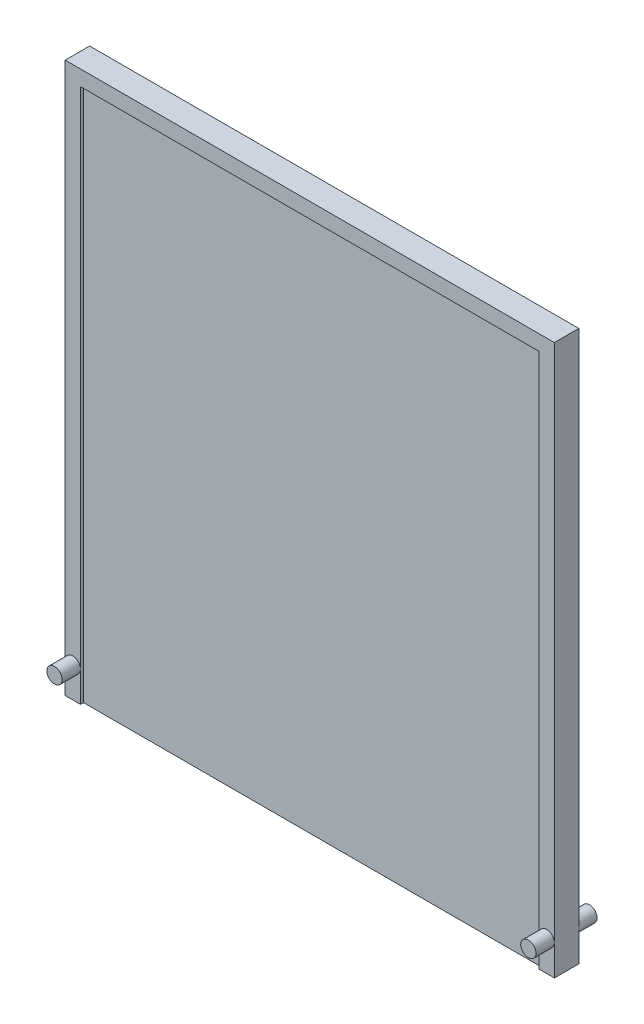
ISO-10303-21;
HEADER;
FILE_DESCRIPTION(('STEP AP214'),'2;1');
FILE_NAME('part.step','',(''),(''),'','','');
FILE_SCHEMA(('AUTOMOTIVE_DESIGN { 1 0 10303 214 1 1 1 1 }'));
ENDSEC;
DATA;
#1=APPLICATION_CONTEXT('core data for automotive mechanical design processes');
#2=APPLICATION_PROTOCOL_DEFINITION('international standard','automotive_design',2000,#1);
#3=PRODUCT_CONTEXT('',#1,'mechanical');
#4=PRODUCT('Part','Part','',(#3));
#5=PRODUCT_RELATED_PRODUCT_CATEGORY('part','',(#4));
#6=PRODUCT_DEFINITION_FORMATION('','',#4);
#7=PRODUCT_DEFINITION_CONTEXT('part definition',#1,'design');
#8=PRODUCT_DEFINITION('design','',#6,#7);
#9=PRODUCT_DEFINITION_SHAPE('','',#8);
#10=(LENGTH_UNIT() NAMED_UNIT(*) SI_UNIT(.MILLI.,.METRE.));
#11=(NAMED_UNIT(*) PLANE_ANGLE_UNIT() SI_UNIT($,.RADIAN.));
#12=(NAMED_UNIT(*) SI_UNIT($,.STERADIAN.) SOLID_ANGLE_UNIT());
#13=UNCERTAINTY_MEASURE_WITH_UNIT(LENGTH_MEASURE(1.E-05),#10,'distance_accuracy_value','');
#14=(GEOMETRIC_REPRESENTATION_CONTEXT(3) GLOBAL_UNCERTAINTY_ASSIGNED_CONTEXT((#13)) GLOBAL_UNIT_ASSIGNED_CONTEXT((#10,
#11,#12)) REPRESENTATION_CONTEXT('',''));
#15=CARTESIAN_POINT('',(0.,0.,0.));
#16=DIRECTION('',(0.,0.,1.));
#17=DIRECTION('',(1.,0.,0.));
#18=AXIS2_PLACEMENT_3D('',#15,#16,#17);
#19=CARTESIAN_POINT('',(0.,0.,4.));
#20=DIRECTION('',(0.,0.,-1.));
#21=DIRECTION('',(-1.,0.,0.));
#22=AXIS2_PLACEMENT_3D('',#19,#20,#21);
#23=PLANE('',#22);
#24=CARTESIAN_POINT('',(77.5,-80.,4.));
#25=DIRECTION('',(0.,0.,-1.));
#26=DIRECTION('',(-1.,0.,0.));
#27=AXIS2_PLACEMENT_3D('',#24,#25,#26);
#28=CIRCLE('',#27,2.50000000000001);
#29=CARTESIAN_POINT('',(75.,-80.,4.));
#30=VERTEX_POINT('',#29);
#31=CARTESIAN_POINT('',(80.,-80.,4.));
#32=VERTEX_POINT('',#31);
#33=EDGE_CURVE('E143',#30,#32,#28,.F.);
#34=ORIENTED_EDGE('',*,*,#33,.F.);
#35=DIRECTION('',(0.,1.,0.));
#36=VECTOR('',#35,1.);
#37=CARTESIAN_POINT('',(75.,-90.,4.));
#38=LINE('',#37,#36);
#39=CARTESIAN_POINT('',(75.,-90.,4.));
#40=VERTEX_POINT('',#39);
#41=EDGE_CURVE('E122',#40,#30,#38,.T.);
#42=ORIENTED_EDGE('',*,*,#41,.F.);
#43=DIRECTION('',(1.,0.,0.));
#44=VECTOR('',#43,1.);
#45=CARTESIAN_POINT('',(-80.,-90.,4.));
#46=LINE('',#45,#44);
#47=CARTESIAN_POINT('',(80.,-90.,4.));
#48=VERTEX_POINT('',#47);
#49=EDGE_CURVE('E220',#40,#48,#46,.T.);
#50=ORIENTED_EDGE('',*,*,#49,.T.);
#51=DIRECTION('',(0.,1.,0.));
#52=VECTOR('',#51,1.);
#53=CARTESIAN_POINT('',(80.,-90.,4.));
#54=LINE('',#53,#52);
#55=EDGE_CURVE('E145',#48,#32,#54,.T.);
#56=ORIENTED_EDGE('',*,*,#55,.T.);
#57=EDGE_LOOP('',(#34,#42,#50,#56));
#58=FACE_BOUND('',#57,.T.);
#59=ADVANCED_FACE('F39',(#58),#23,.F.);
#60=CARTESIAN_POINT('',(-77.5,-80.,4.));
#61=DIRECTION('',(0.,0.,-1.));
#62=DIRECTION('',(-1.,0.,0.));
#63=AXIS2_PLACEMENT_3D('',#60,#61,#62);
#64=CIRCLE('',#63,2.50000000000001);
#65=CARTESIAN_POINT('',(-80.,-80.,4.));
#66=VERTEX_POINT('',#65);
#67=CARTESIAN_POINT('',(-75.,-80.,4.));
#68=VERTEX_POINT('',#67);
#69=EDGE_CURVE('E172',#66,#68,#64,.F.);
#70=ORIENTED_EDGE('',*,*,#69,.F.);
#71=DIRECTION('',(0.,-1.,0.));
#72=VECTOR('',#71,1.);
#73=CARTESIAN_POINT('',(-80.,-90.,4.));
#74=LINE('',#73,#72);
#75=CARTESIAN_POINT('',(-80.,-90.,4.));
#76=VERTEX_POINT('',#75);
#77=EDGE_CURVE('E216',#66,#76,#74,.T.);
#78=ORIENTED_EDGE('',*,*,#77,.T.);
#79=CARTESIAN_POINT('',(-75.,-90.,4.));
#80=VERTEX_POINT('',#79);
#81=EDGE_CURVE('E221',#76,#80,#46,.T.);
#82=ORIENTED_EDGE('',*,*,#81,.T.);
#83=DIRECTION('',(0.,-1.,0.));
#84=VECTOR('',#83,1.);
#85=CARTESIAN_POINT('',(-75.,-90.,4.));
#86=LINE('',#85,#84);
#87=EDGE_CURVE('E194',#68,#80,#86,.T.);
#88=ORIENTED_EDGE('',*,*,#87,.F.);
#89=EDGE_LOOP('',(#70,#78,#82,#88));
#90=FACE_BOUND('',#89,.T.);
#91=ADVANCED_FACE('F283',(#90),#23,.F.);
#92=CARTESIAN_POINT('',(80.,-90.,4.));
#93=DIRECTION('',(-1.,0.,0.));
#94=DIRECTION('',(0.,0.,1.));
#95=AXIS2_PLACEMENT_3D('',#92,#93,#94);
#96=PLANE('',#95);
#97=DIRECTION('',(0.,1.,0.));
#98=VECTOR('',#97,1.);
#99=CARTESIAN_POINT('',(80.,-90.,-4.));
#100=LINE('',#99,#98);
#101=CARTESIAN_POINT('',(80.,-90.,-4.));
#102=VERTEX_POINT('',#101);
#103=CARTESIAN_POINT('',(80.,-80.,-4.));
#104=VERTEX_POINT('',#103);
#105=EDGE_CURVE('E226',#102,#104,#100,.T.);
#106=ORIENTED_EDGE('',*,*,#105,.T.);
#107=CARTESIAN_POINT('',(80.,90.,-4.));
#108=VERTEX_POINT('',#107);
#109=EDGE_CURVE('E200',#104,#108,#100,.T.);
#110=ORIENTED_EDGE('',*,*,#109,.T.);
#111=DIRECTION('',(0.,0.,-1.));
#112=VECTOR('',#111,1.);
#113=CARTESIAN_POINT('',(80.,90.,4.));
#114=LINE('',#113,#112);
#115=CARTESIAN_POINT('',(80.,90.,4.));
#116=VERTEX_POINT('',#115);
#117=EDGE_CURVE('E11',#116,#108,#114,.T.);
#118=ORIENTED_EDGE('',*,*,#117,.F.);
#119=EDGE_CURVE('E213',#32,#116,#54,.T.);
#120=ORIENTED_EDGE('',*,*,#119,.F.);
#121=ORIENTED_EDGE('',*,*,#55,.F.);
#122=DIRECTION('',(0.,0.,-1.));
#123=VECTOR('',#122,1.);
#124=CARTESIAN_POINT('',(80.,-90.,4.));
#125=LINE('',#124,#123);
#126=EDGE_CURVE('E225',#48,#102,#125,.T.);
#127=ORIENTED_EDGE('',*,*,#126,.T.);
#128=EDGE_LOOP('',(#106,#110,#118,#120,#121,#127));
#129=FACE_BOUND('',#128,.T.);
#130=ADVANCED_FACE('F41',(#129),#96,.F.);
#131=CARTESIAN_POINT('',(-80.,90.,4.));
#132=DIRECTION('',(0.,-1.,0.));
#133=DIRECTION('',(0.,0.,-1.));
#134=AXIS2_PLACEMENT_3D('',#131,#132,#133);
#135=PLANE('',#134);
#136=DIRECTION('',(-1.,0.,0.));
#137=VECTOR('',#136,1.);
#138=CARTESIAN_POINT('',(-80.,90.,-4.));
#139=LINE('',#138,#137);
#140=CARTESIAN_POINT('',(-80.,90.,-4.));
#141=VERTEX_POINT('',#140);
#142=EDGE_CURVE('E230',#108,#141,#139,.T.);
#143=ORIENTED_EDGE('',*,*,#142,.T.);
#144=DIRECTION('',(0.,0.,-1.));
#145=VECTOR('',#144,1.);
#146=CARTESIAN_POINT('',(-80.,90.,4.));
#147=LINE('',#146,#145);
#148=CARTESIAN_POINT('',(-80.,90.,4.));
#149=VERTEX_POINT('',#148);
#150=EDGE_CURVE('E48',#149,#141,#147,.T.);
#151=ORIENTED_EDGE('',*,*,#150,.F.);
#152=DIRECTION('',(-1.,0.,0.));
#153=VECTOR('',#152,1.);
#154=CARTESIAN_POINT('',(-80.,90.,4.));
#155=LINE('',#154,#153);
#156=EDGE_CURVE('E212',#116,#149,#155,.T.);
#157=ORIENTED_EDGE('',*,*,#156,.F.);
#158=ORIENTED_EDGE('',*,*,#117,.T.);
#159=EDGE_LOOP('',(#143,#151,#157,#158));
#160=FACE_BOUND('',#159,.T.);
#161=ADVANCED_FACE('F302',(#160),#135,.F.);
#162=CARTESIAN_POINT('',(-80.,-90.,4.));
#163=DIRECTION('',(1.,0.,0.));
#164=DIRECTION('',(0.,0.,-1.));
#165=AXIS2_PLACEMENT_3D('',#162,#163,#164);
#166=PLANE('',#165);
#167=DIRECTION('',(0.,-1.,0.));
#168=VECTOR('',#167,1.);
#169=CARTESIAN_POINT('',(-80.,-90.,-4.));
#170=LINE('',#169,#168);
#171=CARTESIAN_POINT('',(-80.,-80.,-4.));
#172=VERTEX_POINT('',#171);
#173=EDGE_CURVE('E234',#141,#172,#170,.T.);
#174=ORIENTED_EDGE('',*,*,#173,.T.);
#175=CARTESIAN_POINT('',(-80.,-90.,-4.));
#176=VERTEX_POINT('',#175);
#177=EDGE_CURVE('E233',#172,#176,#170,.T.);
#178=ORIENTED_EDGE('',*,*,#177,.T.);
#179=DIRECTION('',(0.,0.,-1.));
#180=VECTOR('',#179,1.);
#181=CARTESIAN_POINT('',(-80.,-90.,4.));
#182=LINE('',#181,#180);
#183=EDGE_CURVE('E244',#76,#176,#182,.T.);
#184=ORIENTED_EDGE('',*,*,#183,.F.);
#185=ORIENTED_EDGE('',*,*,#77,.F.);
#186=EDGE_CURVE('E217',#149,#66,#74,.T.);
#187=ORIENTED_EDGE('',*,*,#186,.F.);
#188=ORIENTED_EDGE('',*,*,#150,.T.);
#189=EDGE_LOOP('',(#174,#178,#184,#185,#187,#188));
#190=FACE_BOUND('',#189,.T.);
#191=ADVANCED_FACE('F253',(#190),#166,.F.);
#192=CARTESIAN_POINT('',(-80.,-90.,4.));
#193=DIRECTION('',(0.,1.,0.));
#194=DIRECTION('',(0.,0.,1.));
#195=AXIS2_PLACEMENT_3D('',#192,#193,#194);
#196=PLANE('',#195);
#197=ORIENTED_EDGE('',*,*,#49,.F.);
#198=DIRECTION('',(0.,0.,1.));
#199=VECTOR('',#198,1.);
#200=CARTESIAN_POINT('',(75.,-90.,3.));
#201=LINE('',#200,#199);
#202=CARTESIAN_POINT('',(75.,-90.,3.));
#203=VERTEX_POINT('',#202);
#204=EDGE_CURVE('E128',#203,#40,#201,.T.);
#205=ORIENTED_EDGE('',*,*,#204,.F.);
#206=DIRECTION('',(1.,0.,0.));
#207=VECTOR('',#206,1.);
#208=CARTESIAN_POINT('',(-75.,-90.,3.));
#209=LINE('',#208,#207);
#210=CARTESIAN_POINT('',(-75.,-90.,3.));
#211=VERTEX_POINT('',#210);
#212=EDGE_CURVE('E187',#211,#203,#209,.T.);
#213=ORIENTED_EDGE('',*,*,#212,.F.);
#214=DIRECTION('',(0.,0.,1.));
#215=VECTOR('',#214,1.);
#216=CARTESIAN_POINT('',(-75.,-90.,3.));
#217=LINE('',#216,#215);
#218=EDGE_CURVE('E201',#211,#80,#217,.T.);
#219=ORIENTED_EDGE('',*,*,#218,.T.);
#220=ORIENTED_EDGE('',*,*,#81,.F.);
#221=ORIENTED_EDGE('',*,*,#183,.T.);
#222=DIRECTION('',(1.,0.,0.));
#223=VECTOR('',#222,1.);
#224=CARTESIAN_POINT('',(-80.,-90.,-4.));
#225=LINE('',#224,#223);
#226=EDGE_CURVE('E238',#176,#102,#225,.T.);
#227=ORIENTED_EDGE('',*,*,#226,.T.);
#228=ORIENTED_EDGE('',*,*,#126,.F.);
#229=EDGE_LOOP('',(#197,#205,#213,#219,#220,#221,#227,#228));
#230=FACE_BOUND('',#229,.T.);
#231=ADVANCED_FACE('F292',(#230),#196,.F.);
#232=EDGE_CURVE('E55',#32,#30,#28,.F.);
#233=ORIENTED_EDGE('',*,*,#232,.F.);
#234=ORIENTED_EDGE('',*,*,#119,.T.);
#235=ORIENTED_EDGE('',*,*,#156,.T.);
#236=ORIENTED_EDGE('',*,*,#186,.T.);
#237=EDGE_CURVE('E165',#68,#66,#64,.F.);
#238=ORIENTED_EDGE('',*,*,#237,.F.);
#239=CARTESIAN_POINT('',(-75.,85.,4.));
#240=VERTEX_POINT('',#239);
#241=EDGE_CURVE('E180',#240,#68,#86,.T.);
#242=ORIENTED_EDGE('',*,*,#241,.F.);
#243=DIRECTION('',(-1.,0.,0.));
#244=VECTOR('',#243,1.);
#245=CARTESIAN_POINT('',(-75.,85.,4.));
#246=LINE('',#245,#244);
#247=CARTESIAN_POINT('',(75.,85.,4.));
#248=VERTEX_POINT('',#247);
#249=EDGE_CURVE('E133',#248,#240,#246,.T.);
#250=ORIENTED_EDGE('',*,*,#249,.F.);
#251=EDGE_CURVE('E125',#30,#248,#38,.T.);
#252=ORIENTED_EDGE('',*,*,#251,.F.);
#253=EDGE_LOOP('',(#233,#234,#235,#236,#238,#242,#250,#252));
#254=FACE_BOUND('',#253,.T.);
#255=ADVANCED_FACE('F136',(#254),#23,.F.);
#256=CARTESIAN_POINT('',(0.,0.,-4.));
#257=DIRECTION('',(0.,0.,-1.));
#258=DIRECTION('',(-1.,0.,0.));
#259=AXIS2_PLACEMENT_3D('',#256,#257,#258);
#260=PLANE('',#259);
#261=ORIENTED_EDGE('',*,*,#109,.F.);
#262=CARTESIAN_POINT('',(77.5,-80.,-4.));
#263=DIRECTION('',(0.,0.,-1.));
#264=DIRECTION('',(-1.,0.,0.));
#265=AXIS2_PLACEMENT_3D('',#262,#263,#264);
#266=CIRCLE('',#265,2.50000000000001);
#267=EDGE_CURVE('E61',#104,#104,#266,.F.);
#268=ORIENTED_EDGE('',*,*,#267,.T.);
#269=ORIENTED_EDGE('',*,*,#105,.F.);
#270=ORIENTED_EDGE('',*,*,#226,.F.);
#271=ORIENTED_EDGE('',*,*,#177,.F.);
#272=CARTESIAN_POINT('',(-77.5,-80.,-4.));
#273=DIRECTION('',(0.,0.,-1.));
#274=DIRECTION('',(-1.,0.,0.));
#275=AXIS2_PLACEMENT_3D('',#272,#273,#274);
#276=CIRCLE('',#275,2.50000000000001);
#277=EDGE_CURVE('E140',#172,#172,#276,.F.);
#278=ORIENTED_EDGE('',*,*,#277,.T.);
#279=ORIENTED_EDGE('',*,*,#173,.F.);
#280=ORIENTED_EDGE('',*,*,#142,.F.);
#281=EDGE_LOOP('',(#261,#268,#269,#270,#271,#278,#279,#280));
#282=FACE_BOUND('',#281,.T.);
#283=ADVANCED_FACE('F260',(#282),#260,.T.);
#284=CARTESIAN_POINT('',(75.,-90.,3.));
#285=DIRECTION('',(1.,0.,0.));
#286=DIRECTION('',(0.,0.,-1.));
#287=AXIS2_PLACEMENT_3D('',#284,#285,#286);
#288=PLANE('',#287);
#289=DIRECTION('',(0.,0.,1.));
#290=VECTOR('',#289,1.);
#291=CARTESIAN_POINT('',(75.,85.,3.));
#292=LINE('',#291,#290);
#293=CARTESIAN_POINT('',(75.,85.,3.));
#294=VERTEX_POINT('',#293);
#295=EDGE_CURVE('E190',#294,#248,#292,.T.);
#296=ORIENTED_EDGE('',*,*,#295,.F.);
#297=DIRECTION('',(0.,1.,0.));
#298=VECTOR('',#297,1.);
#299=CARTESIAN_POINT('',(75.,-90.,3.));
#300=LINE('',#299,#298);
#301=EDGE_CURVE('E176',#203,#294,#300,.T.);
#302=ORIENTED_EDGE('',*,*,#301,.F.);
#303=ORIENTED_EDGE('',*,*,#204,.T.);
#304=ORIENTED_EDGE('',*,*,#41,.T.);
#305=ORIENTED_EDGE('',*,*,#251,.T.);
#306=EDGE_LOOP('',(#296,#302,#303,#304,#305));
#307=FACE_BOUND('',#306,.T.);
#308=ADVANCED_FACE('F124',(#307),#288,.F.);
#309=CARTESIAN_POINT('',(-75.,-90.,3.));
#310=DIRECTION('',(-1.,0.,0.));
#311=DIRECTION('',(0.,0.,1.));
#312=AXIS2_PLACEMENT_3D('',#309,#310,#311);
#313=PLANE('',#312);
#314=ORIENTED_EDGE('',*,*,#218,.F.);
#315=DIRECTION('',(0.,-1.,0.));
#316=VECTOR('',#315,1.);
#317=CARTESIAN_POINT('',(-75.,-90.,3.));
#318=LINE('',#317,#316);
#319=CARTESIAN_POINT('',(-75.,85.,3.));
#320=VERTEX_POINT('',#319);
#321=EDGE_CURVE('E184',#320,#211,#318,.T.);
#322=ORIENTED_EDGE('',*,*,#321,.F.);
#323=DIRECTION('',(0.,0.,1.));
#324=VECTOR('',#323,1.);
#325=CARTESIAN_POINT('',(-75.,85.,3.));
#326=LINE('',#325,#324);
#327=EDGE_CURVE('E205',#320,#240,#326,.T.);
#328=ORIENTED_EDGE('',*,*,#327,.T.);
#329=ORIENTED_EDGE('',*,*,#241,.T.);
#330=ORIENTED_EDGE('',*,*,#87,.T.);
#331=EDGE_LOOP('',(#314,#322,#328,#329,#330));
#332=FACE_BOUND('',#331,.T.);
#333=ADVANCED_FACE('F322',(#332),#313,.F.);
#334=CARTESIAN_POINT('',(-75.,85.,3.));
#335=DIRECTION('',(0.,1.,0.));
#336=DIRECTION('',(0.,0.,1.));
#337=AXIS2_PLACEMENT_3D('',#334,#335,#336);
#338=PLANE('',#337);
#339=ORIENTED_EDGE('',*,*,#249,.T.);
#340=ORIENTED_EDGE('',*,*,#327,.F.);
#341=DIRECTION('',(-1.,0.,0.));
#342=VECTOR('',#341,1.);
#343=CARTESIAN_POINT('',(-75.,85.,3.));
#344=LINE('',#343,#342);
#345=EDGE_CURVE('E179',#294,#320,#344,.T.);
#346=ORIENTED_EDGE('',*,*,#345,.F.);
#347=ORIENTED_EDGE('',*,*,#295,.T.);
#348=EDGE_LOOP('',(#339,#340,#346,#347));
#349=FACE_BOUND('',#348,.T.);
#350=ADVANCED_FACE('F278',(#349),#338,.F.);
#351=CARTESIAN_POINT('',(0.,0.,3.));
#352=DIRECTION('',(0.,0.,-1.));
#353=DIRECTION('',(-1.,0.,0.));
#354=AXIS2_PLACEMENT_3D('',#351,#352,#353);
#355=PLANE('',#354);
#356=ORIENTED_EDGE('',*,*,#301,.T.);
#357=ORIENTED_EDGE('',*,*,#345,.T.);
#358=ORIENTED_EDGE('',*,*,#321,.T.);
#359=ORIENTED_EDGE('',*,*,#212,.T.);
#360=EDGE_LOOP('',(#356,#357,#358,#359));
#361=FACE_BOUND('',#360,.T.);
#362=ADVANCED_FACE('F273',(#361),#355,.F.);
#363=CARTESIAN_POINT('',(-77.5,-80.,-10.));
#364=DIRECTION('',(0.,0.,1.));
#365=DIRECTION('',(1.,0.,0.));
#366=AXIS2_PLACEMENT_3D('',#363,#364,#365);
#367=PLANE('',#366);
#368=CARTESIAN_POINT('',(-77.5,-80.,-10.));
#369=DIRECTION('',(0.,0.,1.));
#370=DIRECTION('',(1.,0.,0.));
#371=AXIS2_PLACEMENT_3D('',#368,#369,#370);
#372=CIRCLE('',#371,2.50000000000001);
#373=CARTESIAN_POINT('',(-75.,-80.,-10.));
#374=VERTEX_POINT('',#373);
#375=EDGE_CURVE('E160',#374,#374,#372,.T.);
#376=ORIENTED_EDGE('',*,*,#375,.F.);
#377=EDGE_LOOP('',(#376));
#378=FACE_BOUND('',#377,.T.);
#379=ADVANCED_FACE('F268',(#378),#367,.F.);
#380=CARTESIAN_POINT('',(-77.5,-80.,10.));
#381=DIRECTION('',(0.,0.,-1.));
#382=DIRECTION('',(-1.,0.,0.));
#383=AXIS2_PLACEMENT_3D('',#380,#381,#382);
#384=CYLINDRICAL_SURFACE('',#383,2.50000000000001);
#385=ORIENTED_EDGE('',*,*,#277,.F.);
#386=EDGE_LOOP('',(#385));
#387=FACE_BOUND('',#386,.T.);
#388=ORIENTED_EDGE('',*,*,#375,.T.);
#389=EDGE_LOOP('',(#388));
#390=FACE_BOUND('',#389,.T.);
#391=ADVANCED_FACE('F264',(#387,#390),#384,.T.);
#392=CARTESIAN_POINT('',(-77.5,-80.,10.));
#393=DIRECTION('',(0.,0.,1.));
#394=DIRECTION('',(1.,0.,0.));
#395=AXIS2_PLACEMENT_3D('',#392,#393,#394);
#396=CIRCLE('',#395,2.50000000000001);
#397=CARTESIAN_POINT('',(-75.,-80.,10.));
#398=VERTEX_POINT('',#397);
#399=EDGE_CURVE('E161',#398,#398,#396,.T.);
#400=ORIENTED_EDGE('',*,*,#399,.F.);
#401=EDGE_LOOP('',(#400));
#402=FACE_BOUND('',#401,.T.);
#403=ORIENTED_EDGE('',*,*,#237,.T.);
#404=ORIENTED_EDGE('',*,*,#69,.T.);
#405=EDGE_LOOP('',(#403,#404));
#406=FACE_BOUND('',#405,.T.);
#407=ADVANCED_FACE('F267',(#402,#406),#384,.T.);
#408=CARTESIAN_POINT('',(-77.5,-80.,10.));
#409=DIRECTION('',(0.,0.,1.));
#410=DIRECTION('',(1.,0.,0.));
#411=AXIS2_PLACEMENT_3D('',#408,#409,#410);
#412=PLANE('',#411);
#413=ORIENTED_EDGE('',*,*,#399,.T.);
#414=EDGE_LOOP('',(#413));
#415=FACE_BOUND('',#414,.T.);
#416=ADVANCED_FACE('F375',(#415),#412,.T.);
#417=CARTESIAN_POINT('',(77.5,-80.,-10.));
#418=DIRECTION('',(0.,0.,-1.));
#419=DIRECTION('',(-1.,0.,0.));
#420=AXIS2_PLACEMENT_3D('',#417,#418,#419);
#421=PLANE('',#420);
#422=CARTESIAN_POINT('',(77.5,-80.,-10.));
#423=DIRECTION('',(0.,0.,1.));
#424=DIRECTION('',(-1.,0.,0.));
#425=AXIS2_PLACEMENT_3D('',#422,#423,#424);
#426=CIRCLE('',#425,2.50000000000001);
#427=CARTESIAN_POINT('',(75.,-80.,-10.));
#428=VERTEX_POINT('',#427);
#429=EDGE_CURVE('E154',#428,#428,#426,.T.);
#430=ORIENTED_EDGE('',*,*,#429,.F.);
#431=EDGE_LOOP('',(#430));
#432=FACE_BOUND('',#431,.T.);
#433=ADVANCED_FACE('F384',(#432),#421,.T.);
#434=CARTESIAN_POINT('',(77.5,-80.,10.));
#435=DIRECTION('',(0.,0.,-1.));
#436=DIRECTION('',(-1.,0.,0.));
#437=AXIS2_PLACEMENT_3D('',#434,#435,#436);
#438=CYLINDRICAL_SURFACE('',#437,2.50000000000001);
#439=ORIENTED_EDGE('',*,*,#267,.F.);
#440=EDGE_LOOP('',(#439));
#441=FACE_BOUND('',#440,.T.);
#442=ORIENTED_EDGE('',*,*,#429,.T.);
#443=EDGE_LOOP('',(#442));
#444=FACE_BOUND('',#443,.T.);
#445=ADVANCED_FACE('F393',(#441,#444),#438,.T.);
#446=CARTESIAN_POINT('',(77.5,-80.,10.));
#447=DIRECTION('',(0.,0.,1.));
#448=DIRECTION('',(-1.,0.,0.));
#449=AXIS2_PLACEMENT_3D('',#446,#447,#448);
#450=CIRCLE('',#449,2.50000000000001);
#451=CARTESIAN_POINT('',(75.,-80.,10.));
#452=VERTEX_POINT('',#451);
#453=EDGE_CURVE('E151',#452,#452,#450,.T.);
#454=ORIENTED_EDGE('',*,*,#453,.F.);
#455=EDGE_LOOP('',(#454));
#456=FACE_BOUND('',#455,.T.);
#457=ORIENTED_EDGE('',*,*,#232,.T.);
#458=ORIENTED_EDGE('',*,*,#33,.T.);
#459=EDGE_LOOP('',(#457,#458));
#460=FACE_BOUND('',#459,.T.);
#461=ADVANCED_FACE('F149',(#456,#460),#438,.T.);
#462=CARTESIAN_POINT('',(77.5,-80.,10.));
#463=DIRECTION('',(0.,0.,-1.));
#464=DIRECTION('',(-1.,0.,0.));
#465=AXIS2_PLACEMENT_3D('',#462,#463,#464);
#466=PLANE('',#465);
#467=ORIENTED_EDGE('',*,*,#453,.T.);
#468=EDGE_LOOP('',(#467));
#469=FACE_BOUND('',#468,.T.);
#470=ADVANCED_FACE('F411',(#469),#466,.F.);
#471=CLOSED_SHELL('',(#59,#91,#130,#161,#191,#231,#255,#283,#308,#333,#350,#362,#379,#391,#407,
#416,#433,#445,#461,#470));
#472=MANIFOLD_SOLID_BREP('B2',#471);
#473=ADVANCED_BREP_SHAPE_REPRESENTATION('',(#18,#472),#14);
#474=SHAPE_DEFINITION_REPRESENTATION(#9,#473);
ENDSEC;
END-ISO-10303-21;
